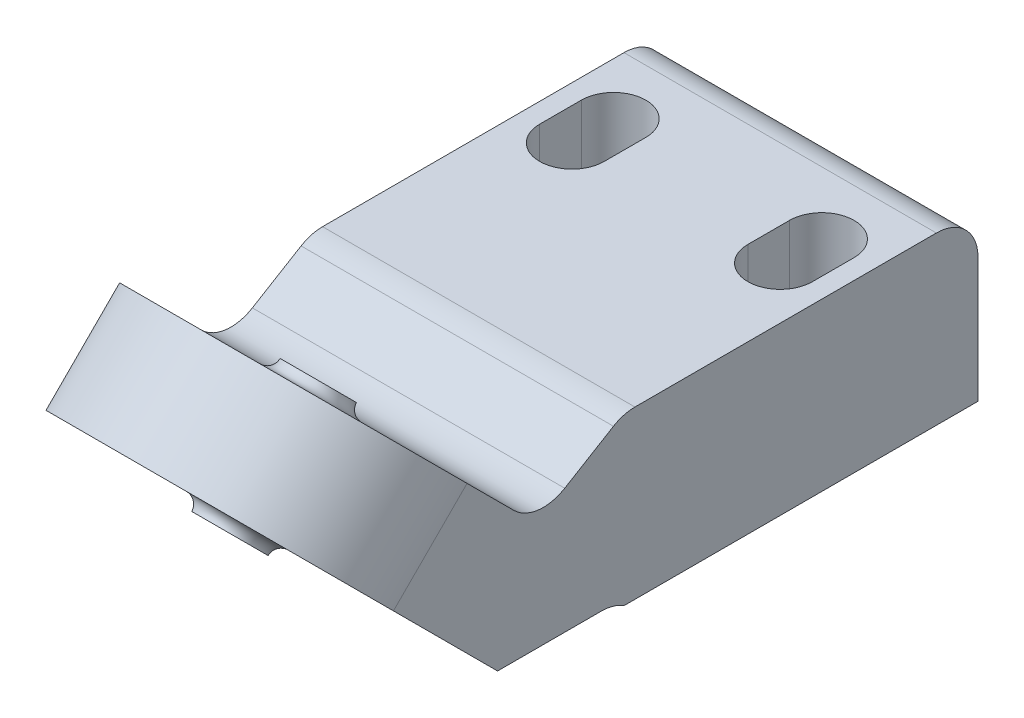
ISO-10303-21;
HEADER;
FILE_DESCRIPTION(('STEP AP214'),'2;1');
FILE_NAME('part.step','',(''),(''),'','','');
FILE_SCHEMA(('AUTOMOTIVE_DESIGN { 1 0 10303 214 1 1 1 1 }'));
ENDSEC;
DATA;
#1=APPLICATION_CONTEXT('core data for automotive mechanical design processes');
#2=APPLICATION_PROTOCOL_DEFINITION('international standard','automotive_design',2000,#1);
#3=PRODUCT_CONTEXT('',#1,'mechanical');
#4=PRODUCT('Part','Part','',(#3));
#5=PRODUCT_RELATED_PRODUCT_CATEGORY('part','',(#4));
#6=PRODUCT_DEFINITION_FORMATION('','',#4);
#7=PRODUCT_DEFINITION_CONTEXT('part definition',#1,'design');
#8=PRODUCT_DEFINITION('design','',#6,#7);
#9=PRODUCT_DEFINITION_SHAPE('','',#8);
#10=(LENGTH_UNIT() NAMED_UNIT(*) SI_UNIT(.MILLI.,.METRE.));
#11=(NAMED_UNIT(*) PLANE_ANGLE_UNIT() SI_UNIT($,.RADIAN.));
#12=(NAMED_UNIT(*) SI_UNIT($,.STERADIAN.) SOLID_ANGLE_UNIT());
#13=UNCERTAINTY_MEASURE_WITH_UNIT(LENGTH_MEASURE(1.E-05),#10,'distance_accuracy_value','');
#14=(GEOMETRIC_REPRESENTATION_CONTEXT(3) GLOBAL_UNCERTAINTY_ASSIGNED_CONTEXT((#13)) GLOBAL_UNIT_ASSIGNED_CONTEXT((#10,
#11,#12)) REPRESENTATION_CONTEXT('',''));
#15=CARTESIAN_POINT('',(0.,0.,0.));
#16=DIRECTION('',(0.,0.,1.));
#17=DIRECTION('',(1.,0.,0.));
#18=AXIS2_PLACEMENT_3D('',#15,#16,#17);
#19=CARTESIAN_POINT('',(7.50000000000001,26.,21.));
#20=DIRECTION('',(0.,0.707106781186551,-0.707106781186544));
#21=DIRECTION('',(0.,0.707106781186544,0.707106781186551));
#22=AXIS2_PLACEMENT_3D('',#19,#20,#21);
#23=PLANE('',#22);
#24=CARTESIAN_POINT('',(0.,29.5355339059327,24.5355339059328));
#25=DIRECTION('',(0.,0.707106781186551,-0.707106781186544));
#26=DIRECTION('',(0.,0.707106781186544,0.707106781186551));
#27=AXIS2_PLACEMENT_3D('',#24,#25,#26);
#28=CIRCLE('',#27,2.);
#29=CARTESIAN_POINT('',(0.,30.9497474683058,25.9497474683059));
#30=VERTEX_POINT('',#29);
#31=EDGE_CURVE('E234',#30,#30,#28,.F.);
#32=ORIENTED_EDGE('',*,*,#31,.T.);
#33=EDGE_LOOP('',(#32));
#34=FACE_BOUND('',#33,.T.);
#35=DIRECTION('',(0.,-0.707106781186544,-0.707106781186551));
#36=VECTOR('',#35,1.);
#37=CARTESIAN_POINT('',(7.50000000000001,26.,21.));
#38=LINE('',#37,#36);
#39=CARTESIAN_POINT('',(7.50000000000001,29.5355339059327,24.5355339059327));
#40=VERTEX_POINT('',#39);
#41=CARTESIAN_POINT('',(7.50000000000001,27.2901535386176,22.2901535386177));
#42=VERTEX_POINT('',#41);
#43=EDGE_CURVE('E322',#40,#42,#38,.T.);
#44=ORIENTED_EDGE('',*,*,#43,.T.);
#45=DIRECTION('',(-1.,0.,0.));
#46=VECTOR('',#45,1.);
#47=CARTESIAN_POINT('',(7.50000000000001,27.2901535386176,22.2901535386177));
#48=LINE('',#47,#46);
#49=CARTESIAN_POINT('',(-7.5,27.2901535386176,22.2901535386177));
#50=VERTEX_POINT('',#49);
#51=EDGE_CURVE('E214',#42,#50,#48,.T.);
#52=ORIENTED_EDGE('',*,*,#51,.T.);
#53=DIRECTION('',(0.,-0.707106781186544,-0.707106781186551));
#54=VECTOR('',#53,1.);
#55=CARTESIAN_POINT('',(-7.5,26.,21.));
#56=LINE('',#55,#54);
#57=CARTESIAN_POINT('',(-7.5,29.5355339059327,24.5355339059327));
#58=VERTEX_POINT('',#57);
#59=EDGE_CURVE('E323',#58,#50,#56,.T.);
#60=ORIENTED_EDGE('',*,*,#59,.F.);
#61=CARTESIAN_POINT('',(0.,29.5355339059327,24.5355339059327));
#62=DIRECTION('',(0.,-0.707106781186551,0.707106781186544));
#63=DIRECTION('',(0.,0.707106781186544,0.707106781186551));
#64=AXIS2_PLACEMENT_3D('',#61,#62,#63);
#65=CIRCLE('',#64,7.5);
#66=EDGE_CURVE('E333',#40,#58,#65,.T.);
#67=ORIENTED_EDGE('',*,*,#66,.F.);
#68=EDGE_LOOP('',(#44,#52,#60,#67));
#69=FACE_BOUND('',#68,.T.);
#70=ADVANCED_FACE('F43',(#34,#69),#23,.T.);
#71=CARTESIAN_POINT('',(7.50000000000001,26.,28.0710678118655));
#72=DIRECTION('',(0.,-0.707106781186551,0.707106781186544));
#73=DIRECTION('',(0.,-0.707106781186544,-0.707106781186551));
#74=AXIS2_PLACEMENT_3D('',#71,#72,#73);
#75=PLANE('',#74);
#76=CARTESIAN_POINT('',(0.,26.,28.0710678118655));
#77=DIRECTION('',(0.,-0.707106781186551,0.707106781186544));
#78=DIRECTION('',(0.,-0.707106781186544,-0.707106781186551));
#79=AXIS2_PLACEMENT_3D('',#76,#77,#78);
#80=CIRCLE('',#79,2.);
#81=CARTESIAN_POINT('',(0.,24.5857864376269,26.6568542494924));
#82=VERTEX_POINT('',#81);
#83=EDGE_CURVE('E237',#82,#82,#80,.F.);
#84=ORIENTED_EDGE('',*,*,#83,.T.);
#85=EDGE_LOOP('',(#84));
#86=FACE_BOUND('',#85,.T.);
#87=DIRECTION('',(0.,0.707106781186544,0.707106781186551));
#88=VECTOR('',#87,1.);
#89=CARTESIAN_POINT('',(-7.5,26.,28.0710678118655));
#90=LINE('',#89,#88);
#91=CARTESIAN_POINT('',(-7.5,21.,23.0710678118655));
#92=VERTEX_POINT('',#91);
#93=CARTESIAN_POINT('',(-7.5,26.,28.0710678118655));
#94=VERTEX_POINT('',#93);
#95=EDGE_CURVE('E330',#92,#94,#90,.T.);
#96=ORIENTED_EDGE('',*,*,#95,.F.);
#97=DIRECTION('',(-1.,0.,0.));
#98=VECTOR('',#97,1.);
#99=CARTESIAN_POINT('',(7.50000000000001,21.,23.0710678118655));
#100=LINE('',#99,#98);
#101=CARTESIAN_POINT('',(7.50000000000001,21.,23.0710678118655));
#102=VERTEX_POINT('',#101);
#103=EDGE_CURVE('E319',#102,#92,#100,.T.);
#104=ORIENTED_EDGE('',*,*,#103,.F.);
#105=DIRECTION('',(0.,0.707106781186544,0.707106781186551));
#106=VECTOR('',#105,1.);
#107=CARTESIAN_POINT('',(7.50000000000001,26.,28.0710678118655));
#108=LINE('',#107,#106);
#109=CARTESIAN_POINT('',(7.50000000000001,26.,28.0710678118655));
#110=VERTEX_POINT('',#109);
#111=EDGE_CURVE('E326',#102,#110,#108,.T.);
#112=ORIENTED_EDGE('',*,*,#111,.T.);
#113=CARTESIAN_POINT('',(0.,26.,28.0710678118655));
#114=DIRECTION('',(0.,-0.707106781186551,0.707106781186544));
#115=DIRECTION('',(0.,0.707106781186544,0.707106781186551));
#116=AXIS2_PLACEMENT_3D('',#113,#114,#115);
#117=CIRCLE('',#116,7.5);
#118=EDGE_CURVE('E340',#110,#94,#117,.T.);
#119=ORIENTED_EDGE('',*,*,#118,.T.);
#120=EDGE_LOOP('',(#96,#104,#112,#119));
#121=FACE_BOUND('',#120,.T.);
#122=ADVANCED_FACE('F375',(#86,#121),#75,.T.);
#123=CARTESIAN_POINT('',(7.5,28.6821178799464,11.));
#124=DIRECTION('',(0.,-1.,0.));
#125=DIRECTION('',(0.,0.,-1.));
#126=AXIS2_PLACEMENT_3D('',#123,#124,#125);
#127=PLANE('',#126);
#128=DIRECTION('',(0.,0.,1.));
#129=VECTOR('',#128,1.);
#130=CARTESIAN_POINT('',(-6.55,28.6821178799464,4.99999999999999));
#131=LINE('',#130,#129);
#132=CARTESIAN_POINT('',(-6.55,28.6821178799464,4.99999999999999));
#133=VERTEX_POINT('',#132);
#134=CARTESIAN_POINT('',(-6.55,28.6821178799464,7.));
#135=VERTEX_POINT('',#134);
#136=EDGE_CURVE('E311',#133,#135,#131,.T.);
#137=ORIENTED_EDGE('',*,*,#136,.F.);
#138=CARTESIAN_POINT('',(-5.,28.6821178799464,5.));
#139=DIRECTION('',(0.,1.,0.));
#140=DIRECTION('',(0.,0.,1.));
#141=AXIS2_PLACEMENT_3D('',#138,#139,#140);
#142=CIRCLE('',#141,1.55);
#143=CARTESIAN_POINT('',(-3.45,28.6821178799464,5.));
#144=VERTEX_POINT('',#143);
#145=EDGE_CURVE('E277',#144,#133,#142,.T.);
#146=ORIENTED_EDGE('',*,*,#145,.F.);
#147=DIRECTION('',(0.,0.,-1.));
#148=VECTOR('',#147,1.);
#149=CARTESIAN_POINT('',(-3.45,28.6821178799464,5.));
#150=LINE('',#149,#148);
#151=CARTESIAN_POINT('',(-3.45,28.6821178799464,7.));
#152=VERTEX_POINT('',#151);
#153=EDGE_CURVE('E301',#152,#144,#150,.T.);
#154=ORIENTED_EDGE('',*,*,#153,.F.);
#155=CARTESIAN_POINT('',(-5.,28.6821178799464,7.));
#156=DIRECTION('',(0.,1.,0.));
#157=DIRECTION('',(0.,0.,1.));
#158=AXIS2_PLACEMENT_3D('',#155,#156,#157);
#159=CIRCLE('',#158,1.55);
#160=EDGE_CURVE('E308',#135,#152,#159,.T.);
#161=ORIENTED_EDGE('',*,*,#160,.F.);
#162=EDGE_LOOP('',(#137,#146,#154,#161));
#163=FACE_BOUND('',#162,.T.);
#164=DIRECTION('',(0.,0.,1.));
#165=VECTOR('',#164,1.);
#166=CARTESIAN_POINT('',(3.45,28.6821178799464,5.));
#167=LINE('',#166,#165);
#168=CARTESIAN_POINT('',(3.45,28.6821178799464,5.));
#169=VERTEX_POINT('',#168);
#170=CARTESIAN_POINT('',(3.45,28.6821178799464,7.));
#171=VERTEX_POINT('',#170);
#172=EDGE_CURVE('E278',#169,#171,#167,.T.);
#173=ORIENTED_EDGE('',*,*,#172,.F.);
#174=CARTESIAN_POINT('',(5.,28.6821178799464,5.));
#175=DIRECTION('',(0.,1.,0.));
#176=DIRECTION('',(0.,0.,-1.));
#177=AXIS2_PLACEMENT_3D('',#174,#175,#176);
#178=CIRCLE('',#177,1.55);
#179=CARTESIAN_POINT('',(6.55,28.6821178799464,5.));
#180=VERTEX_POINT('',#179);
#181=EDGE_CURVE('E275',#180,#169,#178,.T.);
#182=ORIENTED_EDGE('',*,*,#181,.F.);
#183=DIRECTION('',(0.,0.,-1.));
#184=VECTOR('',#183,1.);
#185=CARTESIAN_POINT('',(6.55,28.6821178799464,5.));
#186=LINE('',#185,#184);
#187=CARTESIAN_POINT('',(6.55,28.6821178799464,7.));
#188=VERTEX_POINT('',#187);
#189=EDGE_CURVE('E284',#188,#180,#186,.T.);
#190=ORIENTED_EDGE('',*,*,#189,.F.);
#191=CARTESIAN_POINT('',(5.,28.6821178799464,7.));
#192=DIRECTION('',(0.,1.,0.));
#193=DIRECTION('',(0.,0.,-1.));
#194=AXIS2_PLACEMENT_3D('',#191,#192,#193);
#195=CIRCLE('',#194,1.55);
#196=EDGE_CURVE('E281',#171,#188,#195,.T.);
#197=ORIENTED_EDGE('',*,*,#196,.F.);
#198=EDGE_LOOP('',(#173,#182,#190,#197));
#199=FACE_BOUND('',#198,.T.);
#200=DIRECTION('',(0.,0.,-1.));
#201=VECTOR('',#200,1.);
#202=CARTESIAN_POINT('',(7.5,28.6821178799464,11.));
#203=LINE('',#202,#201);
#204=CARTESIAN_POINT('',(7.5,28.6821178799464,16.4751117573865));
#205=VERTEX_POINT('',#204);
#206=CARTESIAN_POINT('',(7.5,28.6821178799464,2.));
#207=VERTEX_POINT('',#206);
#208=EDGE_CURVE('E266',#205,#207,#203,.T.);
#209=ORIENTED_EDGE('',*,*,#208,.T.);
#210=DIRECTION('',(-1.,0.,0.));
#211=VECTOR('',#210,1.);
#212=CARTESIAN_POINT('',(7.5,28.6821178799464,2.));
#213=LINE('',#212,#211);
#214=CARTESIAN_POINT('',(-7.5,28.6821178799464,2.));
#215=VERTEX_POINT('',#214);
#216=EDGE_CURVE('E201',#207,#215,#213,.T.);
#217=ORIENTED_EDGE('',*,*,#216,.T.);
#218=DIRECTION('',(0.,0.,-1.));
#219=VECTOR('',#218,1.);
#220=CARTESIAN_POINT('',(-7.5,28.6821178799464,11.));
#221=LINE('',#220,#219);
#222=CARTESIAN_POINT('',(-7.5,28.6821178799464,16.4751117573865));
#223=VERTEX_POINT('',#222);
#224=EDGE_CURVE('E186',#223,#215,#221,.T.);
#225=ORIENTED_EDGE('',*,*,#224,.F.);
#226=DIRECTION('',(1.,0.,0.));
#227=VECTOR('',#226,1.);
#228=CARTESIAN_POINT('',(7.5,28.6821178799464,16.4751117573865));
#229=LINE('',#228,#227);
#230=EDGE_CURVE('E225',#223,#205,#229,.T.);
#231=ORIENTED_EDGE('',*,*,#230,.T.);
#232=EDGE_LOOP('',(#209,#217,#225,#231));
#233=FACE_BOUND('',#232,.T.);
#234=ADVANCED_FACE('F382',(#163,#199,#233),#127,.F.);
#235=CARTESIAN_POINT('',(-7.5,28.6821178799464,11.));
#236=DIRECTION('',(1.,0.,0.));
#237=DIRECTION('',(0.,0.,-1.));
#238=AXIS2_PLACEMENT_3D('',#235,#236,#237);
#239=PLANE('',#238);
#240=ORIENTED_EDGE('',*,*,#224,.T.);
#241=CARTESIAN_POINT('',(-7.5,26.6821178799464,2.));
#242=DIRECTION('',(1.,0.,0.));
#243=DIRECTION('',(0.,0.,-1.));
#244=AXIS2_PLACEMENT_3D('',#241,#242,#243);
#245=CIRCLE('',#244,2.);
#246=CARTESIAN_POINT('',(-7.5,26.6821178799464,0.));
#247=VERTEX_POINT('',#246);
#248=EDGE_CURVE('E65',#215,#247,#245,.F.);
#249=ORIENTED_EDGE('',*,*,#248,.T.);
#250=DIRECTION('',(0.,-1.,0.));
#251=VECTOR('',#250,1.);
#252=CARTESIAN_POINT('',(-7.5,28.6821178799464,0.));
#253=LINE('',#252,#251);
#254=CARTESIAN_POINT('',(-7.5,20.6821178799464,0.));
#255=VERTEX_POINT('',#254);
#256=EDGE_CURVE('E183',#247,#255,#253,.T.);
#257=ORIENTED_EDGE('',*,*,#256,.T.);
#258=DIRECTION('',(0.,0.,-1.));
#259=VECTOR('',#258,1.);
#260=CARTESIAN_POINT('',(-7.5,20.6821178799464,11.));
#261=LINE('',#260,#259);
#262=CARTESIAN_POINT('',(-7.5,20.6821178799464,17.));
#263=VERTEX_POINT('',#262);
#264=EDGE_CURVE('E177',#263,#255,#261,.T.);
#265=ORIENTED_EDGE('',*,*,#264,.F.);
#266=CARTESIAN_POINT('',(-7.5,19.,18.0818869802177));
#267=DIRECTION('',(1.,0.,0.));
#268=DIRECTION('',(0.,0.,-1.));
#269=AXIS2_PLACEMENT_3D('',#266,#267,#268);
#270=CIRCLE('',#269,2.);
#271=CARTESIAN_POINT('',(-7.5,21.,18.0818869802177));
#272=VERTEX_POINT('',#271);
#273=EDGE_CURVE('E181',#263,#272,#270,.T.);
#274=ORIENTED_EDGE('',*,*,#273,.T.);
#275=DIRECTION('',(0.,0.,-1.));
#276=VECTOR('',#275,1.);
#277=CARTESIAN_POINT('',(-7.5,21.,21.));
#278=LINE('',#277,#276);
#279=EDGE_CURVE('E291',#92,#272,#278,.T.);
#280=ORIENTED_EDGE('',*,*,#279,.F.);
#281=ORIENTED_EDGE('',*,*,#95,.T.);
#282=DIRECTION('',(0.,0.707106781186552,-0.707106781186543));
#283=VECTOR('',#282,1.);
#284=CARTESIAN_POINT('',(-7.5,29.5355339059327,24.5355339059328));
#285=LINE('',#284,#283);
#286=EDGE_CURVE('E327',#94,#58,#285,.T.);
#287=ORIENTED_EDGE('',*,*,#286,.T.);
#288=ORIENTED_EDGE('',*,*,#59,.T.);
#289=CARTESIAN_POINT('',(-7.5,28.7043671009907,20.8759399762446));
#290=DIRECTION('',(1.,0.,0.));
#291=DIRECTION('',(0.,0.,-1.));
#292=AXIS2_PLACEMENT_3D('',#289,#290,#291);
#293=CIRCLE('',#292,2.);
#294=CARTESIAN_POINT('',(-7.5,26.9900324995865,19.8458638264245));
#295=VERTEX_POINT('',#294);
#296=EDGE_CURVE('E212',#50,#295,#293,.T.);
#297=ORIENTED_EDGE('',*,*,#296,.T.);
#298=DIRECTION('',(0.,0.515038074910051,-0.857167300702114));
#299=VECTOR('',#298,1.);
#300=CARTESIAN_POINT('',(-7.5,31.3440992919737,12.5994797990706));
#301=LINE('',#300,#299);
#302=CARTESIAN_POINT('',(-7.5,28.3964524813507,17.5051879072066));
#303=VERTEX_POINT('',#302);
#304=EDGE_CURVE('E231',#295,#303,#301,.T.);
#305=ORIENTED_EDGE('',*,*,#304,.T.);
#306=CARTESIAN_POINT('',(-7.5,26.6821178799464,16.4751117573865));
#307=DIRECTION('',(1.,0.,0.));
#308=DIRECTION('',(0.,0.,-1.));
#309=AXIS2_PLACEMENT_3D('',#306,#307,#308);
#310=CIRCLE('',#309,2.);
#311=EDGE_CURVE('E217',#303,#223,#310,.F.);
#312=ORIENTED_EDGE('',*,*,#311,.T.);
#313=EDGE_LOOP('',(#240,#249,#257,#265,#274,#280,#281,#287,#288,#297,#305,#312));
#314=FACE_BOUND('',#313,.T.);
#315=ADVANCED_FACE('F179',(#314),#239,.F.);
#316=CARTESIAN_POINT('',(-7.5,20.6821178799464,11.));
#317=DIRECTION('',(0.,1.,0.));
#318=DIRECTION('',(0.,0.,1.));
#319=AXIS2_PLACEMENT_3D('',#316,#317,#318);
#320=PLANE('',#319);
#321=DIRECTION('',(0.,0.,-1.));
#322=VECTOR('',#321,1.);
#323=CARTESIAN_POINT('',(-3.45,20.6821178799464,11.));
#324=LINE('',#323,#322);
#325=CARTESIAN_POINT('',(-3.45,20.6821178799464,7.));
#326=VERTEX_POINT('',#325);
#327=CARTESIAN_POINT('',(-3.45,20.6821178799464,5.));
#328=VERTEX_POINT('',#327);
#329=EDGE_CURVE('E243',#326,#328,#324,.T.);
#330=ORIENTED_EDGE('',*,*,#329,.T.);
#331=CARTESIAN_POINT('',(-5.,20.6821178799464,5.));
#332=DIRECTION('',(0.,1.,0.));
#333=DIRECTION('',(0.,0.,1.));
#334=AXIS2_PLACEMENT_3D('',#331,#332,#333);
#335=CIRCLE('',#334,1.55);
#336=CARTESIAN_POINT('',(-6.55,20.6821178799464,4.99999999999999));
#337=VERTEX_POINT('',#336);
#338=EDGE_CURVE('E240',#328,#337,#335,.T.);
#339=ORIENTED_EDGE('',*,*,#338,.T.);
#340=DIRECTION('',(0.,0.,1.));
#341=VECTOR('',#340,1.);
#342=CARTESIAN_POINT('',(-6.55,20.6821178799464,11.));
#343=LINE('',#342,#341);
#344=CARTESIAN_POINT('',(-6.55,20.6821178799464,7.));
#345=VERTEX_POINT('',#344);
#346=EDGE_CURVE('E249',#337,#345,#343,.T.);
#347=ORIENTED_EDGE('',*,*,#346,.T.);
#348=CARTESIAN_POINT('',(-5.,20.6821178799464,7.));
#349=DIRECTION('',(0.,1.,0.));
#350=DIRECTION('',(0.,0.,1.));
#351=AXIS2_PLACEMENT_3D('',#348,#349,#350);
#352=CIRCLE('',#351,1.55);
#353=EDGE_CURVE('E246',#345,#326,#352,.T.);
#354=ORIENTED_EDGE('',*,*,#353,.T.);
#355=EDGE_LOOP('',(#330,#339,#347,#354));
#356=FACE_BOUND('',#355,.T.);
#357=DIRECTION('',(0.,0.,-1.));
#358=VECTOR('',#357,1.);
#359=CARTESIAN_POINT('',(6.55,20.6821178799464,11.));
#360=LINE('',#359,#358);
#361=CARTESIAN_POINT('',(6.55,20.6821178799464,7.));
#362=VERTEX_POINT('',#361);
#363=CARTESIAN_POINT('',(6.55,20.6821178799464,5.));
#364=VERTEX_POINT('',#363);
#365=EDGE_CURVE('E255',#362,#364,#360,.T.);
#366=ORIENTED_EDGE('',*,*,#365,.T.);
#367=CARTESIAN_POINT('',(5.,20.6821178799464,5.));
#368=DIRECTION('',(0.,1.,0.));
#369=DIRECTION('',(0.,0.,1.));
#370=AXIS2_PLACEMENT_3D('',#367,#368,#369);
#371=CIRCLE('',#370,1.55);
#372=CARTESIAN_POINT('',(3.45,20.6821178799464,5.));
#373=VERTEX_POINT('',#372);
#374=EDGE_CURVE('E252',#364,#373,#371,.T.);
#375=ORIENTED_EDGE('',*,*,#374,.T.);
#376=DIRECTION('',(0.,0.,1.));
#377=VECTOR('',#376,1.);
#378=CARTESIAN_POINT('',(3.45,20.6821178799464,11.));
#379=LINE('',#378,#377);
#380=CARTESIAN_POINT('',(3.45,20.6821178799464,7.));
#381=VERTEX_POINT('',#380);
#382=EDGE_CURVE('E261',#373,#381,#379,.T.);
#383=ORIENTED_EDGE('',*,*,#382,.T.);
#384=CARTESIAN_POINT('',(5.,20.6821178799464,7.));
#385=DIRECTION('',(0.,1.,0.));
#386=DIRECTION('',(0.,0.,1.));
#387=AXIS2_PLACEMENT_3D('',#384,#385,#386);
#388=CIRCLE('',#387,1.55);
#389=EDGE_CURVE('E258',#381,#362,#388,.T.);
#390=ORIENTED_EDGE('',*,*,#389,.T.);
#391=EDGE_LOOP('',(#366,#375,#383,#390));
#392=FACE_BOUND('',#391,.T.);
#393=DIRECTION('',(1.,0.,0.));
#394=VECTOR('',#393,1.);
#395=CARTESIAN_POINT('',(-7.5,20.6821178799464,0.));
#396=LINE('',#395,#394);
#397=CARTESIAN_POINT('',(7.5,20.6821178799464,0.));
#398=VERTEX_POINT('',#397);
#399=EDGE_CURVE('E271',#255,#398,#396,.T.);
#400=ORIENTED_EDGE('',*,*,#399,.T.);
#401=DIRECTION('',(0.,0.,-1.));
#402=VECTOR('',#401,1.);
#403=CARTESIAN_POINT('',(7.5,20.6821178799464,11.));
#404=LINE('',#403,#402);
#405=CARTESIAN_POINT('',(7.5,20.6821178799464,17.));
#406=VERTEX_POINT('',#405);
#407=EDGE_CURVE('E187',#406,#398,#404,.T.);
#408=ORIENTED_EDGE('',*,*,#407,.F.);
#409=DIRECTION('',(-1.,0.,0.));
#410=VECTOR('',#409,1.);
#411=CARTESIAN_POINT('',(-7.5,20.6821178799464,17.));
#412=LINE('',#411,#410);
#413=EDGE_CURVE('E191',#406,#263,#412,.T.);
#414=ORIENTED_EDGE('',*,*,#413,.T.);
#415=ORIENTED_EDGE('',*,*,#264,.T.);
#416=EDGE_LOOP('',(#400,#408,#414,#415));
#417=FACE_BOUND('',#416,.T.);
#418=ADVANCED_FACE('F192',(#356,#392,#417),#320,.F.);
#419=CARTESIAN_POINT('',(7.5,20.6821178799464,11.));
#420=DIRECTION('',(-1.,0.,0.));
#421=DIRECTION('',(0.,0.,1.));
#422=AXIS2_PLACEMENT_3D('',#419,#420,#421);
#423=PLANE('',#422);
#424=DIRECTION('',(0.,1.,0.));
#425=VECTOR('',#424,1.);
#426=CARTESIAN_POINT('',(7.5,20.6821178799464,0.));
#427=LINE('',#426,#425);
#428=CARTESIAN_POINT('',(7.5,26.6821178799464,0.));
#429=VERTEX_POINT('',#428);
#430=EDGE_CURVE('E269',#398,#429,#427,.T.);
#431=ORIENTED_EDGE('',*,*,#430,.T.);
#432=CARTESIAN_POINT('',(7.5,26.6821178799464,2.));
#433=DIRECTION('',(-1.,0.,0.));
#434=DIRECTION('',(0.,0.,1.));
#435=AXIS2_PLACEMENT_3D('',#432,#433,#434);
#436=CIRCLE('',#435,2.);
#437=EDGE_CURVE('E11',#429,#207,#436,.F.);
#438=ORIENTED_EDGE('',*,*,#437,.T.);
#439=ORIENTED_EDGE('',*,*,#208,.F.);
#440=CARTESIAN_POINT('',(7.5,26.6821178799464,16.4751117573865));
#441=DIRECTION('',(-1.,0.,0.));
#442=DIRECTION('',(0.,0.,1.));
#443=AXIS2_PLACEMENT_3D('',#440,#441,#442);
#444=CIRCLE('',#443,2.);
#445=CARTESIAN_POINT('',(7.5,28.3964524813507,17.5051879072066));
#446=VERTEX_POINT('',#445);
#447=EDGE_CURVE('E223',#205,#446,#444,.F.);
#448=ORIENTED_EDGE('',*,*,#447,.T.);
#449=DIRECTION('',(0.,-0.515038074910051,0.857167300702114));
#450=VECTOR('',#449,1.);
#451=CARTESIAN_POINT('',(7.5,29.2219855431173,16.1312701705063));
#452=LINE('',#451,#450);
#453=CARTESIAN_POINT('',(7.5,26.9900324995865,19.8458638264245));
#454=VERTEX_POINT('',#453);
#455=EDGE_CURVE('E228',#446,#454,#452,.T.);
#456=ORIENTED_EDGE('',*,*,#455,.T.);
#457=CARTESIAN_POINT('',(7.5,28.7043671009907,20.8759399762446));
#458=DIRECTION('',(-1.,0.,0.));
#459=DIRECTION('',(0.,0.,1.));
#460=AXIS2_PLACEMENT_3D('',#457,#458,#459);
#461=CIRCLE('',#460,2.);
#462=EDGE_CURVE('E210',#454,#42,#461,.T.);
#463=ORIENTED_EDGE('',*,*,#462,.T.);
#464=ORIENTED_EDGE('',*,*,#43,.F.);
#465=DIRECTION('',(0.,0.707106781186552,-0.707106781186543));
#466=VECTOR('',#465,1.);
#467=CARTESIAN_POINT('',(7.50000000000001,29.5355339059327,24.5355339059328));
#468=LINE('',#467,#466);
#469=EDGE_CURVE('E336',#110,#40,#468,.T.);
#470=ORIENTED_EDGE('',*,*,#469,.F.);
#471=ORIENTED_EDGE('',*,*,#111,.F.);
#472=DIRECTION('',(0.,0.,-1.));
#473=VECTOR('',#472,1.);
#474=CARTESIAN_POINT('',(7.5,21.,21.));
#475=LINE('',#474,#473);
#476=CARTESIAN_POINT('',(7.5,21.,18.0818869802177));
#477=VERTEX_POINT('',#476);
#478=EDGE_CURVE('E316',#102,#477,#475,.T.);
#479=ORIENTED_EDGE('',*,*,#478,.T.);
#480=CARTESIAN_POINT('',(7.5,19.,18.0818869802177));
#481=DIRECTION('',(-1.,0.,0.));
#482=DIRECTION('',(0.,0.,1.));
#483=AXIS2_PLACEMENT_3D('',#480,#481,#482);
#484=CIRCLE('',#483,2.);
#485=EDGE_CURVE('E202',#477,#406,#484,.T.);
#486=ORIENTED_EDGE('',*,*,#485,.T.);
#487=ORIENTED_EDGE('',*,*,#407,.T.);
#488=EDGE_LOOP('',(#431,#438,#439,#448,#456,#463,#464,#470,#471,#479,#486,#487));
#489=FACE_BOUND('',#488,.T.);
#490=ADVANCED_FACE('F429',(#489),#423,.F.);
#491=CARTESIAN_POINT('',(0.,0.,0.));
#492=DIRECTION('',(0.,0.,1.));
#493=DIRECTION('',(1.,0.,0.));
#494=AXIS2_PLACEMENT_3D('',#491,#492,#493);
#495=PLANE('',#494);
#496=ORIENTED_EDGE('',*,*,#256,.F.);
#497=DIRECTION('',(-1.,0.,0.));
#498=VECTOR('',#497,1.);
#499=CARTESIAN_POINT('',(0.,26.6821178799464,0.));
#500=LINE('',#499,#498);
#501=EDGE_CURVE('E51',#247,#429,#500,.F.);
#502=ORIENTED_EDGE('',*,*,#501,.T.);
#503=ORIENTED_EDGE('',*,*,#430,.F.);
#504=ORIENTED_EDGE('',*,*,#399,.F.);
#505=EDGE_LOOP('',(#496,#502,#503,#504));
#506=FACE_BOUND('',#505,.T.);
#507=ADVANCED_FACE('F415',(#506),#495,.F.);
#508=CARTESIAN_POINT('',(5.,17.6821178799464,5.));
#509=DIRECTION('',(0.,1.,0.));
#510=DIRECTION('',(0.,0.,1.));
#511=AXIS2_PLACEMENT_3D('',#508,#509,#510);
#512=CYLINDRICAL_SURFACE('',#511,1.55);
#513=DIRECTION('',(0.,1.,0.));
#514=VECTOR('',#513,1.);
#515=CARTESIAN_POINT('',(6.55,17.6821178799464,5.));
#516=LINE('',#515,#514);
#517=EDGE_CURVE('E288',#364,#180,#516,.T.);
#518=ORIENTED_EDGE('',*,*,#517,.T.);
#519=ORIENTED_EDGE('',*,*,#181,.T.);
#520=DIRECTION('',(0.,1.,0.));
#521=VECTOR('',#520,1.);
#522=CARTESIAN_POINT('',(3.45,17.6821178799464,5.));
#523=LINE('',#522,#521);
#524=EDGE_CURVE('E287',#373,#169,#523,.T.);
#525=ORIENTED_EDGE('',*,*,#524,.F.);
#526=ORIENTED_EDGE('',*,*,#374,.F.);
#527=EDGE_LOOP('',(#518,#519,#525,#526));
#528=FACE_BOUND('',#527,.T.);
#529=ADVANCED_FACE('F411',(#528),#512,.F.);
#530=CARTESIAN_POINT('',(6.55,17.6821178799464,5.));
#531=DIRECTION('',(1.,0.,0.));
#532=DIRECTION('',(0.,0.,-1.));
#533=AXIS2_PLACEMENT_3D('',#530,#531,#532);
#534=PLANE('',#533);
#535=DIRECTION('',(0.,1.,0.));
#536=VECTOR('',#535,1.);
#537=CARTESIAN_POINT('',(6.55,17.6821178799464,7.));
#538=LINE('',#537,#536);
#539=EDGE_CURVE('E290',#362,#188,#538,.T.);
#540=ORIENTED_EDGE('',*,*,#539,.T.);
#541=ORIENTED_EDGE('',*,*,#189,.T.);
#542=ORIENTED_EDGE('',*,*,#517,.F.);
#543=ORIENTED_EDGE('',*,*,#365,.F.);
#544=EDGE_LOOP('',(#540,#541,#542,#543));
#545=FACE_BOUND('',#544,.T.);
#546=ADVANCED_FACE('F414',(#545),#534,.F.);
#547=CARTESIAN_POINT('',(5.,17.6821178799464,7.));
#548=DIRECTION('',(0.,1.,0.));
#549=DIRECTION('',(0.,0.,1.));
#550=AXIS2_PLACEMENT_3D('',#547,#548,#549);
#551=CYLINDRICAL_SURFACE('',#550,1.55);
#552=DIRECTION('',(0.,1.,0.));
#553=VECTOR('',#552,1.);
#554=CARTESIAN_POINT('',(3.45,17.6821178799464,7.));
#555=LINE('',#554,#553);
#556=EDGE_CURVE('E293',#381,#171,#555,.T.);
#557=ORIENTED_EDGE('',*,*,#556,.T.);
#558=ORIENTED_EDGE('',*,*,#196,.T.);
#559=ORIENTED_EDGE('',*,*,#539,.F.);
#560=ORIENTED_EDGE('',*,*,#389,.F.);
#561=EDGE_LOOP('',(#557,#558,#559,#560));
#562=FACE_BOUND('',#561,.T.);
#563=ADVANCED_FACE('F419',(#562),#551,.F.);
#564=CARTESIAN_POINT('',(3.45,17.6821178799464,5.));
#565=DIRECTION('',(-1.,0.,0.));
#566=DIRECTION('',(0.,0.,1.));
#567=AXIS2_PLACEMENT_3D('',#564,#565,#566);
#568=PLANE('',#567);
#569=ORIENTED_EDGE('',*,*,#524,.T.);
#570=ORIENTED_EDGE('',*,*,#172,.T.);
#571=ORIENTED_EDGE('',*,*,#556,.F.);
#572=ORIENTED_EDGE('',*,*,#382,.F.);
#573=EDGE_LOOP('',(#569,#570,#571,#572));
#574=FACE_BOUND('',#573,.T.);
#575=ADVANCED_FACE('F409',(#574),#568,.F.);
#576=CARTESIAN_POINT('',(-5.,17.6821178799464,5.));
#577=DIRECTION('',(0.,1.,0.));
#578=DIRECTION('',(0.,0.,1.));
#579=AXIS2_PLACEMENT_3D('',#576,#577,#578);
#580=CYLINDRICAL_SURFACE('',#579,1.55);
#581=DIRECTION('',(0.,1.,0.));
#582=VECTOR('',#581,1.);
#583=CARTESIAN_POINT('',(-3.45,17.6821178799464,5.));
#584=LINE('',#583,#582);
#585=EDGE_CURVE('E274',#328,#144,#584,.T.);
#586=ORIENTED_EDGE('',*,*,#585,.T.);
#587=ORIENTED_EDGE('',*,*,#145,.T.);
#588=DIRECTION('',(0.,1.,0.));
#589=VECTOR('',#588,1.);
#590=CARTESIAN_POINT('',(-6.55,17.6821178799464,4.99999999999999));
#591=LINE('',#590,#589);
#592=EDGE_CURVE('E297',#337,#133,#591,.T.);
#593=ORIENTED_EDGE('',*,*,#592,.F.);
#594=ORIENTED_EDGE('',*,*,#338,.F.);
#595=EDGE_LOOP('',(#586,#587,#593,#594));
#596=FACE_BOUND('',#595,.T.);
#597=ADVANCED_FACE('F399',(#596),#580,.F.);
#598=CARTESIAN_POINT('',(-3.45,17.6821178799464,5.));
#599=DIRECTION('',(1.,0.,0.));
#600=DIRECTION('',(0.,0.,-1.));
#601=AXIS2_PLACEMENT_3D('',#598,#599,#600);
#602=PLANE('',#601);
#603=DIRECTION('',(0.,1.,0.));
#604=VECTOR('',#603,1.);
#605=CARTESIAN_POINT('',(-3.45,17.6821178799464,7.));
#606=LINE('',#605,#604);
#607=EDGE_CURVE('E303',#326,#152,#606,.T.);
#608=ORIENTED_EDGE('',*,*,#607,.T.);
#609=ORIENTED_EDGE('',*,*,#153,.T.);
#610=ORIENTED_EDGE('',*,*,#585,.F.);
#611=ORIENTED_EDGE('',*,*,#329,.F.);
#612=EDGE_LOOP('',(#608,#609,#610,#611));
#613=FACE_BOUND('',#612,.T.);
#614=ADVANCED_FACE('F395',(#613),#602,.F.);
#615=CARTESIAN_POINT('',(-5.,17.6821178799464,7.));
#616=DIRECTION('',(0.,1.,0.));
#617=DIRECTION('',(0.,0.,1.));
#618=AXIS2_PLACEMENT_3D('',#615,#616,#617);
#619=CYLINDRICAL_SURFACE('',#618,1.55);
#620=DIRECTION('',(0.,1.,0.));
#621=VECTOR('',#620,1.);
#622=CARTESIAN_POINT('',(-6.55,17.6821178799464,7.));
#623=LINE('',#622,#621);
#624=EDGE_CURVE('E300',#345,#135,#623,.T.);
#625=ORIENTED_EDGE('',*,*,#624,.T.);
#626=ORIENTED_EDGE('',*,*,#160,.T.);
#627=ORIENTED_EDGE('',*,*,#607,.F.);
#628=ORIENTED_EDGE('',*,*,#353,.F.);
#629=EDGE_LOOP('',(#625,#626,#627,#628));
#630=FACE_BOUND('',#629,.T.);
#631=ADVANCED_FACE('F398',(#630),#619,.F.);
#632=CARTESIAN_POINT('',(-6.55,17.6821178799464,4.99999999999999));
#633=DIRECTION('',(-1.,0.,0.));
#634=DIRECTION('',(0.,0.,1.));
#635=AXIS2_PLACEMENT_3D('',#632,#633,#634);
#636=PLANE('',#635);
#637=ORIENTED_EDGE('',*,*,#592,.T.);
#638=ORIENTED_EDGE('',*,*,#136,.T.);
#639=ORIENTED_EDGE('',*,*,#624,.F.);
#640=ORIENTED_EDGE('',*,*,#346,.F.);
#641=EDGE_LOOP('',(#637,#638,#639,#640));
#642=FACE_BOUND('',#641,.T.);
#643=ADVANCED_FACE('F393',(#642),#636,.F.);
#644=CARTESIAN_POINT('',(7.5,21.,21.));
#645=DIRECTION('',(0.,1.,0.));
#646=DIRECTION('',(0.,0.,1.));
#647=AXIS2_PLACEMENT_3D('',#644,#645,#646);
#648=PLANE('',#647);
#649=ORIENTED_EDGE('',*,*,#279,.T.);
#650=DIRECTION('',(1.,0.,0.));
#651=VECTOR('',#650,1.);
#652=CARTESIAN_POINT('',(7.5,21.,18.0818869802177));
#653=LINE('',#652,#651);
#654=EDGE_CURVE('E200',#272,#477,#653,.T.);
#655=ORIENTED_EDGE('',*,*,#654,.T.);
#656=ORIENTED_EDGE('',*,*,#478,.F.);
#657=ORIENTED_EDGE('',*,*,#103,.T.);
#658=EDGE_LOOP('',(#649,#655,#656,#657));
#659=FACE_BOUND('',#658,.T.);
#660=ADVANCED_FACE('F390',(#659),#648,.F.);
#661=CARTESIAN_POINT('',(0.,29.5355339059327,24.5355339059327));
#662=DIRECTION('',(0.,-0.707106781186551,0.707106781186544));
#663=DIRECTION('',(0.,-0.707106781186544,-0.707106781186551));
#664=AXIS2_PLACEMENT_3D('',#661,#662,#663);
#665=CYLINDRICAL_SURFACE('',#664,7.5);
#666=ORIENTED_EDGE('',*,*,#118,.F.);
#667=ORIENTED_EDGE('',*,*,#469,.T.);
#668=ORIENTED_EDGE('',*,*,#66,.T.);
#669=ORIENTED_EDGE('',*,*,#286,.F.);
#670=EDGE_LOOP('',(#666,#667,#668,#669));
#671=FACE_BOUND('',#670,.T.);
#672=ADVANCED_FACE('F387',(#671),#665,.T.);
#673=CARTESIAN_POINT('',(0.,29.5355339059327,24.5355339059327));
#674=DIRECTION('',(0.,-0.707106781186551,0.707106781186544));
#675=DIRECTION('',(0.,-0.707106781186544,-0.707106781186551));
#676=AXIS2_PLACEMENT_3D('',#673,#674,#675);
#677=CYLINDRICAL_SURFACE('',#676,1.1);
#678=CARTESIAN_POINT('',(0.,25.6464466094067,28.4246212024587));
#679=DIRECTION('',(0.,-0.707106781186551,0.707106781186544));
#680=DIRECTION('',(0.,-0.707106781186544,-0.707106781186551));
#681=AXIS2_PLACEMENT_3D('',#678,#679,#680);
#682=CIRCLE('',#681,1.10000000000001);
#683=CARTESIAN_POINT('',(0.,24.8686291501015,27.6468037431535));
#684=VERTEX_POINT('',#683);
#685=EDGE_CURVE('E346',#684,#684,#682,.T.);
#686=ORIENTED_EDGE('',*,*,#685,.T.);
#687=EDGE_LOOP('',(#686));
#688=FACE_BOUND('',#687,.T.);
#689=CARTESIAN_POINT('',(0.,29.889087296526,24.1819805153395));
#690=DIRECTION('',(0.,0.707106781186551,-0.707106781186544));
#691=DIRECTION('',(0.,0.707106781186544,0.707106781186551));
#692=AXIS2_PLACEMENT_3D('',#689,#690,#691);
#693=CIRCLE('',#692,1.1);
#694=CARTESIAN_POINT('',(0.,30.6669047558312,24.9597979746447));
#695=VERTEX_POINT('',#694);
#696=EDGE_CURVE('E195',#695,#695,#693,.T.);
#697=ORIENTED_EDGE('',*,*,#696,.T.);
#698=EDGE_LOOP('',(#697));
#699=FACE_BOUND('',#698,.T.);
#700=ADVANCED_FACE('F355',(#688,#699),#677,.F.);
#701=CARTESIAN_POINT('',(0.,25.6464466094067,28.4246212024587));
#702=DIRECTION('',(0.,-0.707106781186551,0.707106781186544));
#703=DIRECTION('',(0.,-0.707106781186544,-0.707106781186551));
#704=AXIS2_PLACEMENT_3D('',#701,#702,#703);
#705=PLANE('',#704);
#706=CARTESIAN_POINT('',(0.,25.6464466094067,28.4246212024587));
#707=DIRECTION('',(0.,-0.707106781186551,0.707106781186544));
#708=DIRECTION('',(0.,-0.707106781186544,-0.707106781186551));
#709=AXIS2_PLACEMENT_3D('',#706,#707,#708);
#710=CIRCLE('',#709,1.5);
#711=CARTESIAN_POINT('',(0.,24.5857864376269,27.3639610306789));
#712=VERTEX_POINT('',#711);
#713=EDGE_CURVE('E342',#712,#712,#710,.T.);
#714=ORIENTED_EDGE('',*,*,#713,.T.);
#715=EDGE_LOOP('',(#714));
#716=FACE_BOUND('',#715,.T.);
#717=ORIENTED_EDGE('',*,*,#685,.F.);
#718=EDGE_LOOP('',(#717));
#719=FACE_BOUND('',#718,.T.);
#720=ADVANCED_FACE('F360',(#716,#719),#705,.T.);
#721=CARTESIAN_POINT('',(0.,29.889087296526,24.1819805153395));
#722=DIRECTION('',(0.,0.707106781186551,-0.707106781186544));
#723=DIRECTION('',(0.,0.707106781186544,0.707106781186551));
#724=AXIS2_PLACEMENT_3D('',#721,#722,#723);
#725=PLANE('',#724);
#726=CARTESIAN_POINT('',(0.,29.889087296526,24.1819805153395));
#727=DIRECTION('',(0.,0.707106781186551,-0.707106781186544));
#728=DIRECTION('',(0.,0.707106781186544,0.707106781186551));
#729=AXIS2_PLACEMENT_3D('',#726,#727,#728);
#730=CIRCLE('',#729,1.5);
#731=CARTESIAN_POINT('',(0.,30.9497474683058,25.2426406871193));
#732=VERTEX_POINT('',#731);
#733=EDGE_CURVE('E349',#732,#732,#730,.T.);
#734=ORIENTED_EDGE('',*,*,#733,.T.);
#735=EDGE_LOOP('',(#734));
#736=FACE_BOUND('',#735,.T.);
#737=ORIENTED_EDGE('',*,*,#696,.F.);
#738=EDGE_LOOP('',(#737));
#739=FACE_BOUND('',#738,.T.);
#740=ADVANCED_FACE('F357',(#736,#739),#725,.T.);
#741=CARTESIAN_POINT('',(0.,25.6464466094067,28.4246212024588));
#742=DIRECTION('',(0.,-0.707106781186551,0.707106781186544));
#743=DIRECTION('',(0.,-0.707106781186544,-0.707106781186551));
#744=AXIS2_PLACEMENT_3D('',#741,#742,#743);
#745=TOROIDAL_SURFACE('',#744,2.,0.5);
#746=ORIENTED_EDGE('',*,*,#83,.F.);
#747=EDGE_LOOP('',(#746));
#748=FACE_BOUND('',#747,.T.);
#749=ORIENTED_EDGE('',*,*,#713,.F.);
#750=EDGE_LOOP('',(#749));
#751=FACE_BOUND('',#750,.T.);
#752=ADVANCED_FACE('F359',(#748,#751),#745,.F.);
#753=CARTESIAN_POINT('',(0.,29.889087296526,24.1819805153395));
#754=DIRECTION('',(0.,0.707106781186551,-0.707106781186544));
#755=DIRECTION('',(0.,0.707106781186544,0.707106781186551));
#756=AXIS2_PLACEMENT_3D('',#753,#754,#755);
#757=TOROIDAL_SURFACE('',#756,2.,0.5);
#758=ORIENTED_EDGE('',*,*,#31,.F.);
#759=EDGE_LOOP('',(#758));
#760=FACE_BOUND('',#759,.T.);
#761=ORIENTED_EDGE('',*,*,#733,.F.);
#762=EDGE_LOOP('',(#761));
#763=FACE_BOUND('',#762,.T.);
#764=ADVANCED_FACE('F368',(#760,#763),#757,.F.);
#765=CARTESIAN_POINT('',(-7.5,26.,21.4935546023465));
#766=DIRECTION('',(0.,-0.857167300702114,-0.515038074910051));
#767=DIRECTION('',(-1.,0.,0.));
#768=AXIS2_PLACEMENT_3D('',#765,#766,#767);
#769=PLANE('',#768);
#770=ORIENTED_EDGE('',*,*,#455,.F.);
#771=DIRECTION('',(1.,0.,0.));
#772=VECTOR('',#771,1.);
#773=CARTESIAN_POINT('',(-7.5,28.3964524813507,17.5051879072066));
#774=LINE('',#773,#772);
#775=EDGE_CURVE('E219',#446,#303,#774,.F.);
#776=ORIENTED_EDGE('',*,*,#775,.T.);
#777=ORIENTED_EDGE('',*,*,#304,.F.);
#778=DIRECTION('',(-1.,0.,0.));
#779=VECTOR('',#778,1.);
#780=CARTESIAN_POINT('',(-7.5,26.9900324995865,19.8458638264245));
#781=LINE('',#780,#779);
#782=EDGE_CURVE('E221',#295,#454,#781,.F.);
#783=ORIENTED_EDGE('',*,*,#782,.T.);
#784=EDGE_LOOP('',(#770,#776,#777,#783));
#785=FACE_BOUND('',#784,.T.);
#786=ADVANCED_FACE('F442',(#785),#769,.F.);
#787=CARTESIAN_POINT('',(7.5,26.6821178799464,16.4751117573865));
#788=DIRECTION('',(1.,0.,0.));
#789=DIRECTION('',(0.,0.,-1.));
#790=AXIS2_PLACEMENT_3D('',#787,#788,#789);
#791=CYLINDRICAL_SURFACE('',#790,2.);
#792=ORIENTED_EDGE('',*,*,#311,.F.);
#793=ORIENTED_EDGE('',*,*,#775,.F.);
#794=ORIENTED_EDGE('',*,*,#447,.F.);
#795=ORIENTED_EDGE('',*,*,#230,.F.);
#796=EDGE_LOOP('',(#792,#793,#794,#795));
#797=FACE_BOUND('',#796,.T.);
#798=ADVANCED_FACE('F448',(#797),#791,.T.);
#799=CARTESIAN_POINT('',(7.50000000000001,28.7043671009907,20.8759399762446));
#800=DIRECTION('',(-1.,0.,0.));
#801=DIRECTION('',(0.,0.,1.));
#802=AXIS2_PLACEMENT_3D('',#799,#800,#801);
#803=CYLINDRICAL_SURFACE('',#802,2.);
#804=ORIENTED_EDGE('',*,*,#462,.F.);
#805=ORIENTED_EDGE('',*,*,#782,.F.);
#806=ORIENTED_EDGE('',*,*,#296,.F.);
#807=ORIENTED_EDGE('',*,*,#51,.F.);
#808=EDGE_LOOP('',(#804,#805,#806,#807));
#809=FACE_BOUND('',#808,.T.);
#810=ADVANCED_FACE('F452',(#809),#803,.F.);
#811=CARTESIAN_POINT('',(0.,19.,18.0818869802177));
#812=DIRECTION('',(1.,0.,0.));
#813=DIRECTION('',(0.,0.,-1.));
#814=AXIS2_PLACEMENT_3D('',#811,#812,#813);
#815=CYLINDRICAL_SURFACE('',#814,2.);
#816=ORIENTED_EDGE('',*,*,#273,.F.);
#817=ORIENTED_EDGE('',*,*,#413,.F.);
#818=ORIENTED_EDGE('',*,*,#485,.F.);
#819=ORIENTED_EDGE('',*,*,#654,.F.);
#820=EDGE_LOOP('',(#816,#817,#818,#819));
#821=FACE_BOUND('',#820,.T.);
#822=ADVANCED_FACE('F198',(#821),#815,.F.);
#823=CARTESIAN_POINT('',(7.5,26.6821178799464,2.));
#824=DIRECTION('',(-1.,0.,0.));
#825=DIRECTION('',(0.,0.,1.));
#826=AXIS2_PLACEMENT_3D('',#823,#824,#825);
#827=CYLINDRICAL_SURFACE('',#826,2.);
#828=ORIENTED_EDGE('',*,*,#437,.F.);
#829=ORIENTED_EDGE('',*,*,#501,.F.);
#830=ORIENTED_EDGE('',*,*,#248,.F.);
#831=ORIENTED_EDGE('',*,*,#216,.F.);
#832=EDGE_LOOP('',(#828,#829,#830,#831));
#833=FACE_BOUND('',#832,.T.);
#834=ADVANCED_FACE('F45',(#833),#827,.T.);
#835=CLOSED_SHELL('',(#70,#122,#234,#315,#418,#490,#507,#529,#546,#563,#575,#597,#614,#631,#643,
#660,#672,#700,#720,#740,#752,#764,#786,#798,#810,#822,#834));
#836=MANIFOLD_SOLID_BREP('B2',#835);
#837=ADVANCED_BREP_SHAPE_REPRESENTATION('',(#18,#836),#14);
#838=SHAPE_DEFINITION_REPRESENTATION(#9,#837);
ENDSEC;
END-ISO-10303-21;
